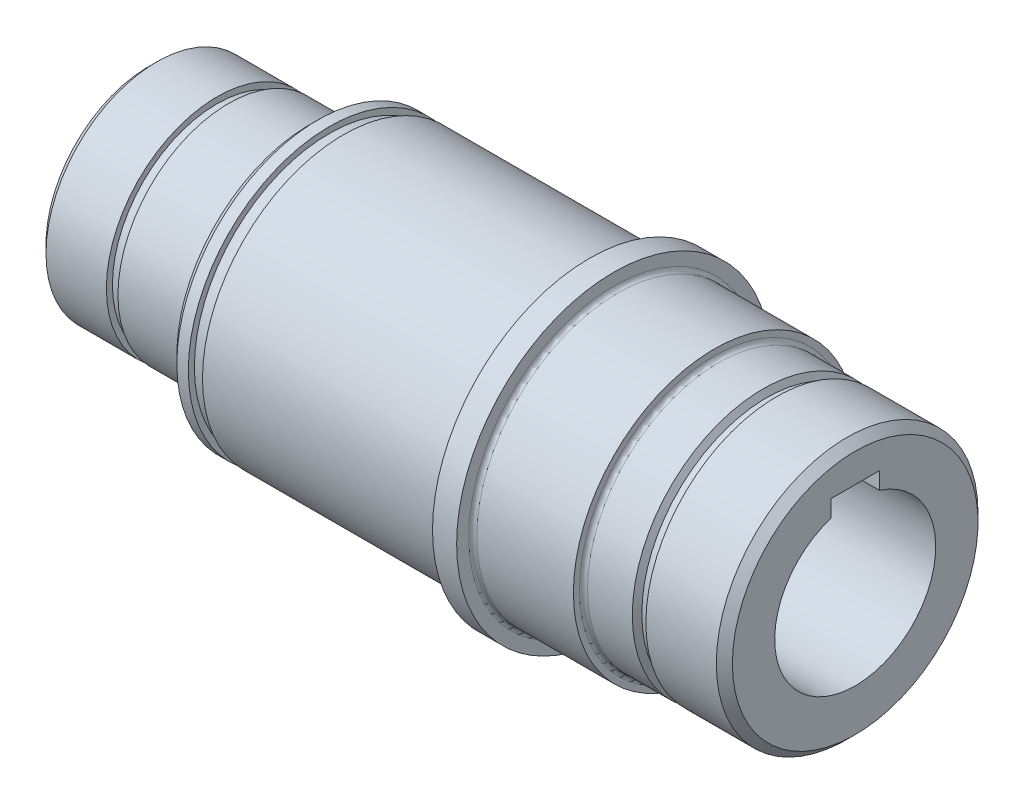
ISO-10303-21;
HEADER;
FILE_DESCRIPTION(('STEP AP214'),'2;1');
FILE_NAME('part.step','',(''),(''),'','','');
FILE_SCHEMA(('AUTOMOTIVE_DESIGN { 1 0 10303 214 1 1 1 1 }'));
ENDSEC;
DATA;
#1=APPLICATION_CONTEXT('core data for automotive mechanical design processes');
#2=APPLICATION_PROTOCOL_DEFINITION('international standard','automotive_design',2000,#1);
#3=PRODUCT_CONTEXT('',#1,'mechanical');
#4=PRODUCT('Part','Part','',(#3));
#5=PRODUCT_RELATED_PRODUCT_CATEGORY('part','',(#4));
#6=PRODUCT_DEFINITION_FORMATION('','',#4);
#7=PRODUCT_DEFINITION_CONTEXT('part definition',#1,'design');
#8=PRODUCT_DEFINITION('design','',#6,#7);
#9=PRODUCT_DEFINITION_SHAPE('','',#8);
#10=(LENGTH_UNIT() NAMED_UNIT(*) SI_UNIT(.MILLI.,.METRE.));
#11=(NAMED_UNIT(*) PLANE_ANGLE_UNIT() SI_UNIT($,.RADIAN.));
#12=(NAMED_UNIT(*) SI_UNIT($,.STERADIAN.) SOLID_ANGLE_UNIT());
#13=UNCERTAINTY_MEASURE_WITH_UNIT(LENGTH_MEASURE(1.E-05),#10,'distance_accuracy_value','');
#14=(GEOMETRIC_REPRESENTATION_CONTEXT(3) GLOBAL_UNCERTAINTY_ASSIGNED_CONTEXT((#13)) GLOBAL_UNIT_ASSIGNED_CONTEXT((#10,
#11,#12)) REPRESENTATION_CONTEXT('',''));
#15=CARTESIAN_POINT('',(0.,0.,0.));
#16=DIRECTION('',(0.,0.,1.));
#17=DIRECTION('',(1.,0.,0.));
#18=AXIS2_PLACEMENT_3D('',#15,#16,#17);
#19=CARTESIAN_POINT('',(0.,0.,0.));
#20=DIRECTION('',(-1.,0.,0.));
#21=DIRECTION('',(0.,0.,1.));
#22=AXIS2_PLACEMENT_3D('',#19,#20,#21);
#23=CYLINDRICAL_SURFACE('',#22,35.);
#24=CARTESIAN_POINT('',(108.5,0.,0.));
#25=DIRECTION('',(1.,0.,0.));
#26=DIRECTION('',(0.,0.,-1.));
#27=AXIS2_PLACEMENT_3D('',#24,#25,#26);
#28=CIRCLE('',#27,35.);
#29=CARTESIAN_POINT('',(108.5,0.,-35.));
#30=VERTEX_POINT('',#29);
#31=EDGE_CURVE('E233',#30,#30,#28,.F.);
#32=ORIENTED_EDGE('',*,*,#31,.T.);
#33=EDGE_LOOP('',(#32));
#34=FACE_BOUND('',#33,.T.);
#35=CARTESIAN_POINT('',(48.3660254037844,0.,0.));
#36=DIRECTION('',(-1.,0.,0.));
#37=DIRECTION('',(0.,0.,1.));
#38=AXIS2_PLACEMENT_3D('',#35,#36,#37);
#39=CIRCLE('',#38,35.);
#40=CARTESIAN_POINT('',(48.3660254037844,0.,35.));
#41=VERTEX_POINT('',#40);
#42=EDGE_CURVE('E120',#41,#41,#39,.T.);
#43=ORIENTED_EDGE('',*,*,#42,.F.);
#44=EDGE_LOOP('',(#43));
#45=FACE_BOUND('',#44,.T.);
#46=CARTESIAN_POINT('',(96.5,-33.5410196624969,-10.));
#47=CARTESIAN_POINT('',(96.7750872189912,-33.54098247272,-10.0000365360893));
#48=CARTESIAN_POINT('',(97.0501610866309,-33.5444026068776,-9.98865070675198));
#49=CARTESIAN_POINT('',(97.5982225360111,-33.55788623849,-9.94330432826118));
#50=CARTESIAN_POINT('',(97.8712105384974,-33.5679483583608,-9.90934846024637));
#51=CARTESIAN_POINT('',(98.4125165939655,-33.594413604027,-9.81923831824626));
#52=CARTESIAN_POINT('',(98.6808441515656,-33.6108017015027,-9.76313664788186));
#53=CARTESIAN_POINT('',(99.211600382103,-33.6494095200446,-9.62923263708805));
#54=CARTESIAN_POINT('',(99.4740289233076,-33.6716293712015,-9.55142981256278));
#55=CARTESIAN_POINT('',(99.9910594066903,-33.7212290569954,-9.37481209906698));
#56=CARTESIAN_POINT('',(100.245665225122,-33.7486062865157,-9.27600781522334));
#57=CARTESIAN_POINT('',(100.745614243321,-33.8077446180219,-9.05809844793721));
#58=CARTESIAN_POINT('',(100.990953970474,-33.8395073431819,-8.93898584406154));
#59=CARTESIAN_POINT('',(101.470763720506,-33.9065191207983,-8.6813404394909));
#60=CARTESIAN_POINT('',(101.705231950015,-33.9417687454718,-8.54280444976229));
#61=CARTESIAN_POINT('',(102.161831999763,-34.0147841313153,-8.24727956170076));
#62=CARTESIAN_POINT('',(102.383963189026,-34.0525500209621,-8.09028972082816));
#63=CARTESIAN_POINT('',(102.820103075119,-34.1305798802948,-7.75460900510778));
#64=CARTESIAN_POINT('',(103.033754390697,-34.17088316088,-7.57546276900981));
#65=CARTESIAN_POINT('',(103.445314601006,-34.2519587918208,-7.20001350476827));
#66=CARTESIAN_POINT('',(103.643223272493,-34.2927311488189,-7.0037102334069));
#67=CARTESIAN_POINT('',(104.022063940254,-34.3736408909465,-6.59516291750775));
#68=CARTESIAN_POINT('',(104.202992879867,-34.4137781606715,-6.38291601516099));
#69=CARTESIAN_POINT('',(104.546629614172,-34.4923217776482,-5.94385936590824));
#70=CARTESIAN_POINT('',(104.709337925007,-34.5307281739127,-5.71705003180525));
#71=CARTESIAN_POINT('',(105.018300842206,-34.6054699464445,-5.24589340555309));
#72=CARTESIAN_POINT('',(105.164187116516,-34.6417525803369,-5.00129596788593));
#73=CARTESIAN_POINT('',(105.434712979143,-34.7104015648878,-4.50021525068414));
#74=CARTESIAN_POINT('',(105.559360803192,-34.7427694321742,-4.24373662766712));
#75=CARTESIAN_POINT('',(105.78647166388,-34.8026802322956,-3.72058575986785));
#76=CARTESIAN_POINT('',(105.888934538248,-34.8302231298386,-3.45391344054172));
#77=CARTESIAN_POINT('',(106.070791583086,-34.8796844486166,-2.91230878338613));
#78=CARTESIAN_POINT('',(106.150186465233,-34.9016030433665,-2.63737670067014));
#79=CARTESIAN_POINT('',(106.283430843011,-34.9386824573288,-2.08857017737901));
#80=CARTESIAN_POINT('',(106.337892722128,-34.9540046534084,-1.81485525332598));
#81=CARTESIAN_POINT('',(106.423772221713,-34.9782725964626,-1.2635532068249));
#82=CARTESIAN_POINT('',(106.455190204717,-34.9872184437524,-0.985966145364852));
#83=CARTESIAN_POINT('',(106.494690755232,-34.9984783115281,-0.429042577413923));
#84=CARTESIAN_POINT('',(106.502776691916,-35.0007932895185,-0.149706329346247));
#85=CARTESIAN_POINT('',(106.495547124931,-34.99872781944,0.40863588853731));
#86=CARTESIAN_POINT('',(106.48023200763,-34.9943474819159,0.687641863730135));
#87=CARTESIAN_POINT('',(106.427125950851,-34.979239676817,1.23515924205468));
#88=CARTESIAN_POINT('',(106.389998894474,-34.9686997350484,1.503740537151));
#89=CARTESIAN_POINT('',(106.294137218641,-34.9417087498089,2.03670936087621));
#90=CARTESIAN_POINT('',(106.235403089012,-34.9252578403382,2.30109698443278));
#91=CARTESIAN_POINT('',(106.096828297775,-34.8868841581542,2.82382541600096));
#92=CARTESIAN_POINT('',(106.016990941752,-34.8649622424428,3.08216716413866));
#93=CARTESIAN_POINT('',(105.836810274628,-34.8162103963017,3.59122625345116));
#94=CARTESIAN_POINT('',(105.736459138934,-34.7893785934989,3.84194064326846));
#95=CARTESIAN_POINT('',(105.514872653335,-34.7312018919979,4.33662254761107));
#96=CARTESIAN_POINT('',(105.393428790896,-34.6998125025795,4.58049139181082));
#97=CARTESIAN_POINT('',(105.131233286698,-34.6335400843056,5.05725829801619));
#98=CARTESIAN_POINT('',(104.990473062352,-34.5986555043474,5.29015142117991));
#99=CARTESIAN_POINT('',(104.690637059534,-34.5262997215508,5.74345927995585));
#100=CARTESIAN_POINT('',(104.531558327985,-34.4888281020536,5.96387199506769));
#101=CARTESIAN_POINT('',(104.196219908203,-34.4122822535693,6.39076242941755));
#102=CARTESIAN_POINT('',(104.019967281927,-34.373208687104,6.59724581781994));
#103=CARTESIAN_POINT('',(103.644792481781,-34.2930504133064,7.00219950736256));
#104=CARTESIAN_POINT('',(103.445288342202,-34.2519435020112,7.20012664060528));
#105=CARTESIAN_POINT('',(103.030351607355,-34.1702230234806,7.57847708088305));
#106=CARTESIAN_POINT('',(102.81492423327,-34.1296092995715,7.75890608103356));
#107=CARTESIAN_POINT('',(102.369353305942,-34.0499816296953,8.10121311351374));
#108=CARTESIAN_POINT('',(102.139202750601,-34.0109684596198,8.26308221533716));
#109=CARTESIAN_POINT('',(101.665765191648,-33.935682173311,8.56702972033076));
#110=CARTESIAN_POINT('',(101.422478586095,-33.8994089741285,8.70910872273119));
#111=CARTESIAN_POINT('',(100.922213172047,-33.8303722143045,8.9735591116493));
#112=CARTESIAN_POINT('',(100.665134658013,-33.7976414958782,9.09575063013379));
#113=CARTESIAN_POINT('',(100.141012358617,-33.7370601860415,9.31794179575966));
#114=CARTESIAN_POINT('',(99.8739690730358,-33.7092093502798,9.41794255412977));
#115=CARTESIAN_POINT('',(99.3321579702681,-33.6592997079518,9.59478968632395));
#116=CARTESIAN_POINT('',(99.0574000396033,-33.6372338320702,9.6716643377374));
#117=CARTESIAN_POINT('',(98.5020089105734,-33.5995731264667,9.80169669852144));
#118=CARTESIAN_POINT('',(98.2213784974586,-33.5839752989599,9.85486539589321));
#119=CARTESIAN_POINT('',(97.7006697711561,-33.5616603042316,9.93057481078496));
#120=CARTESIAN_POINT('',(97.4611367403342,-33.553933788227,9.95661201264007));
#121=CARTESIAN_POINT('',(96.9810754105778,-33.5436069779552,9.99132081128702));
#122=CARTESIAN_POINT('',(96.7405491928636,-33.5409988653378,10.0000188938676));
#123=CARTESIAN_POINT('',(96.5,-33.5410196624969,10.));
#124=B_SPLINE_CURVE_WITH_KNOTS('',3,(#46,#47,#48,#49,#50,#51,#52,#53,#54,#55,#56,#57,#58,#59,
#60,#61,#62,#63,#64,#65,#66,#67,#68,#69,#70,#71,#72,#73,#74,#75,#76,#77,#78,#79,#80,#81,#82,#83,
#84,#85,#86,#87,#88,#89,#90,#91,#92,#93,#94,#95,#96,#97,#98,#99,#100,#101,#102,#103,#104,#105,
#106,#107,#108,#109,#110,#111,#112,#113,#114,#115,#116,#117,#118,#119,#120,#121,#122,#123),
.UNSPECIFIED.,.F.,.F.,(4,2,2,2,2,2,2,2,2,2,2,2,2,2,2,2,2,2,2,2,2,2,2,2,2,2,2,2,2,2,2,2,2,2,2,2,
2,2,4),(0.,0.824984357624068,1.64979766274566,2.4726634396547,3.29554757401041,4.11801715879569,
4.94079197884894,5.76370204493681,6.58665415984562,7.43083682322429,8.27503145566178,
9.1193777681235,9.96370015635821,10.8239516934824,11.6838688839443,12.5437923639629,
13.4036893113833,14.2411536565694,15.0786048261527,15.9159350607945,16.7532514706184,
17.5663142232641,18.379358545133,19.1922755880901,20.0055032833981,20.8272825171044,
21.6494280707064,22.4717063462234,23.2936479140539,24.1447133665263,24.995500984547,
25.8466962750067,26.6978657862673,27.5563505279373,28.4147922702562,29.2721800407936,
30.1291699873618,30.8517080106868,31.5731414970245),.UNSPECIFIED.);
#125=CARTESIAN_POINT('',(96.5,-33.5410196624969,-10.));
#126=VERTEX_POINT('',#125);
#127=CARTESIAN_POINT('',(96.5,-33.5410196624969,10.));
#128=VERTEX_POINT('',#127);
#129=EDGE_CURVE('E239',#126,#128,#124,.T.);
#130=ORIENTED_EDGE('',*,*,#129,.F.);
#131=DIRECTION('',(-1.,0.,0.));
#132=VECTOR('',#131,1.);
#133=CARTESIAN_POINT('',(0.,-33.5410196624969,-10.));
#134=LINE('',#133,#132);
#135=CARTESIAN_POINT('',(60.5,-33.5410196624969,-10.));
#136=VERTEX_POINT('',#135);
#137=EDGE_CURVE('E11',#136,#126,#134,.F.);
#138=ORIENTED_EDGE('',*,*,#137,.F.);
#139=CARTESIAN_POINT('',(60.5,-33.5410196624969,10.));
#140=CARTESIAN_POINT('',(60.2249127810088,-33.54098247272,10.0000365360893));
#141=CARTESIAN_POINT('',(59.9498389133691,-33.5444026068776,9.98865070675198));
#142=CARTESIAN_POINT('',(59.4017774639889,-33.55788623849,9.94330432826118));
#143=CARTESIAN_POINT('',(59.1287894615026,-33.5679483583608,9.90934846024636));
#144=CARTESIAN_POINT('',(58.5874834060345,-33.594413604027,9.81923831824626));
#145=CARTESIAN_POINT('',(58.3191558484344,-33.6108017015027,9.76313664788186));
#146=CARTESIAN_POINT('',(57.788399617897,-33.6494095200446,9.62923263708805));
#147=CARTESIAN_POINT('',(57.5259710766924,-33.6716293712015,9.55142981256278));
#148=CARTESIAN_POINT('',(57.0089405933097,-33.7212290569954,9.37481209906698));
#149=CARTESIAN_POINT('',(56.754334774878,-33.7486062865157,9.27600781522333));
#150=CARTESIAN_POINT('',(56.254385756679,-33.8077446180219,9.0580984479372));
#151=CARTESIAN_POINT('',(56.0090460295259,-33.8395073431819,8.93898584406154));
#152=CARTESIAN_POINT('',(55.5292362794943,-33.9065191207983,8.68134043949089));
#153=CARTESIAN_POINT('',(55.2947680499847,-33.9417687454718,8.54280444976228));
#154=CARTESIAN_POINT('',(54.8381680002374,-34.0147841313154,8.24727956170075));
#155=CARTESIAN_POINT('',(54.6160368109742,-34.0525500209621,8.09028972082816));
#156=CARTESIAN_POINT('',(54.1798969248815,-34.1305798802948,7.75460900510779));
#157=CARTESIAN_POINT('',(53.9662456093028,-34.17088316088,7.57546276900981));
#158=CARTESIAN_POINT('',(53.5546853989937,-34.2519587918208,7.20001350476826));
#159=CARTESIAN_POINT('',(53.3567767275066,-34.2927311488189,7.0037102334069));
#160=CARTESIAN_POINT('',(52.9779360597461,-34.3736408909465,6.59516291750775));
#161=CARTESIAN_POINT('',(52.7970071201329,-34.4137781606715,6.38291601516098));
#162=CARTESIAN_POINT('',(52.4533703858284,-34.4923217776482,5.94385936590823));
#163=CARTESIAN_POINT('',(52.2906620749933,-34.5307281739127,5.71705003180523));
#164=CARTESIAN_POINT('',(51.9816991577943,-34.6054699464445,5.24589340555307));
#165=CARTESIAN_POINT('',(51.8358128834841,-34.6417525803369,5.00129596788592));
#166=CARTESIAN_POINT('',(51.5652870208566,-34.7104015648878,4.50021525068413));
#167=CARTESIAN_POINT('',(51.4406391968075,-34.7427694321742,4.24373662766711));
#168=CARTESIAN_POINT('',(51.2135283361205,-34.8026802322956,3.72058575986784));
#169=CARTESIAN_POINT('',(51.1110654617519,-34.8302231298386,3.45391344054171));
#170=CARTESIAN_POINT('',(50.9292084169142,-34.8796844486166,2.91230878338613));
#171=CARTESIAN_POINT('',(50.849813534767,-34.9016030433665,2.63737670067014));
#172=CARTESIAN_POINT('',(50.7165691569895,-34.9386824573288,2.088570177379));
#173=CARTESIAN_POINT('',(50.6621072778723,-34.9540046534084,1.81485525332598));
#174=CARTESIAN_POINT('',(50.5762277782868,-34.9782725964626,1.26355320682489));
#175=CARTESIAN_POINT('',(50.5448097952828,-34.9872184437524,0.98596614536485));
#176=CARTESIAN_POINT('',(50.505309244768,-34.9984783115281,0.429042577413922));
#177=CARTESIAN_POINT('',(50.4972233080835,-35.0007932895185,0.149706329346246));
#178=CARTESIAN_POINT('',(50.504452875069,-34.99872781944,-0.408635888537313));
#179=CARTESIAN_POINT('',(50.5197679923695,-34.9943474819159,-0.687641863730138));
#180=CARTESIAN_POINT('',(50.5728740491488,-34.979239676817,-1.23515924205469));
#181=CARTESIAN_POINT('',(50.610001105526,-34.9686997350484,-1.50374053715101));
#182=CARTESIAN_POINT('',(50.705862781359,-34.9417087498089,-2.03670936087622));
#183=CARTESIAN_POINT('',(50.7645969109882,-34.9252578403382,-2.30109698443279));
#184=CARTESIAN_POINT('',(50.9031717022248,-34.8868841581542,-2.82382541600097));
#185=CARTESIAN_POINT('',(50.9830090582476,-34.8649622424428,-3.08216716413866));
#186=CARTESIAN_POINT('',(51.1631897253718,-34.8162103963017,-3.59122625345116));
#187=CARTESIAN_POINT('',(51.2635408610665,-34.7893785934989,-3.84194064326847));
#188=CARTESIAN_POINT('',(51.4851273466646,-34.7312018919979,-4.33662254761108));
#189=CARTESIAN_POINT('',(51.6065712091042,-34.6998125025795,-4.58049139181083));
#190=CARTESIAN_POINT('',(51.8687667133016,-34.6335400843056,-5.0572582980162));
#191=CARTESIAN_POINT('',(52.0095269376479,-34.5986555043474,-5.29015142117992));
#192=CARTESIAN_POINT('',(52.309362940466,-34.5262997215508,-5.74345927995586));
#193=CARTESIAN_POINT('',(52.4684416720154,-34.4888281020536,-5.96387199506769));
#194=CARTESIAN_POINT('',(52.8037800917972,-34.4122822535693,-6.39076242941755));
#195=CARTESIAN_POINT('',(52.9800327180733,-34.373208687104,-6.59724581781994));
#196=CARTESIAN_POINT('',(53.3552075182186,-34.2930504133064,-7.00219950736256));
#197=CARTESIAN_POINT('',(53.5547116577979,-34.2519435020112,-7.20012664060527));
#198=CARTESIAN_POINT('',(53.9696483926452,-34.1702230234806,-7.57847708088304));
#199=CARTESIAN_POINT('',(54.1850757667298,-34.1296092995715,-7.75890608103355));
#200=CARTESIAN_POINT('',(54.6306466940576,-34.0499816296953,-8.10121311351374));
#201=CARTESIAN_POINT('',(54.8607972493985,-34.0109684596198,-8.26308221533716));
#202=CARTESIAN_POINT('',(55.3342348083521,-33.9356821733109,-8.56702972033075));
#203=CARTESIAN_POINT('',(55.5775214139048,-33.8994089741285,-8.70910872273119));
#204=CARTESIAN_POINT('',(56.0777868279535,-33.8303722143045,-8.97355911164931));
#205=CARTESIAN_POINT('',(56.334865341987,-33.7976414958782,-9.09575063013379));
#206=CARTESIAN_POINT('',(56.8589876413826,-33.7370601860415,-9.31794179575967));
#207=CARTESIAN_POINT('',(57.1260309269642,-33.7092093502798,-9.41794255412978));
#208=CARTESIAN_POINT('',(57.6678420297319,-33.6592997079518,-9.59478968632395));
#209=CARTESIAN_POINT('',(57.9425999603967,-33.6372338320702,-9.67166433773741));
#210=CARTESIAN_POINT('',(58.4979910894266,-33.5995731264667,-9.80169669852144));
#211=CARTESIAN_POINT('',(58.7786215025414,-33.5839752989599,-9.85486539589321));
#212=CARTESIAN_POINT('',(59.2993302288439,-33.5616603042316,-9.93057481078497));
#213=CARTESIAN_POINT('',(59.5388632596659,-33.553933788227,-9.95661201264007));
#214=CARTESIAN_POINT('',(60.0189245894223,-33.5436069779552,-9.99132081128703));
#215=CARTESIAN_POINT('',(60.2594508071364,-33.5409988653378,-10.0000188938676));
#216=CARTESIAN_POINT('',(60.5,-33.5410196624969,-10.));
#217=B_SPLINE_CURVE_WITH_KNOTS('',3,(#139,#140,#141,#142,#143,#144,#145,#146,#147,#148,#149,
#150,#151,#152,#153,#154,#155,#156,#157,#158,#159,#160,#161,#162,#163,#164,#165,#166,#167,#168,
#169,#170,#171,#172,#173,#174,#175,#176,#177,#178,#179,#180,#181,#182,#183,#184,#185,#186,#187,
#188,#189,#190,#191,#192,#193,#194,#195,#196,#197,#198,#199,#200,#201,#202,#203,#204,#205,#206,
#207,#208,#209,#210,#211,#212,#213,#214,#215,#216),.UNSPECIFIED.,.F.,.F.,(4,2,2,2,2,2,2,2,2,2,2,
2,2,2,2,2,2,2,2,2,2,2,2,2,2,2,2,2,2,2,2,2,2,2,2,2,2,2,4),(0.,0.824984357624061,1.64979766274566,
2.4726634396547,3.29554757401041,4.11801715879571,4.94079197884896,5.76370204493684,
6.58665415984562,7.4308368232243,8.27503145566178,9.11937776812352,9.96370015635822,
10.8239516934824,11.6838688839443,12.5437923639629,13.4036893113833,14.2411536565694,
15.0786048261527,15.9159350607945,16.7532514706184,17.5663142232641,18.379358545133,
19.1922755880901,20.0055032833981,20.8272825171044,21.6494280707064,22.4717063462234,
23.2936479140539,24.1447133665263,24.995500984547,25.8466962750067,26.6978657862673,
27.5563505279373,28.4147922702562,29.2721800407936,30.1291699873618,30.8517080106868,
31.5731414970245),.UNSPECIFIED.);
#218=CARTESIAN_POINT('',(60.5,-33.5410196624969,10.));
#219=VERTEX_POINT('',#218);
#220=EDGE_CURVE('E43',#219,#136,#217,.T.);
#221=ORIENTED_EDGE('',*,*,#220,.F.);
#222=DIRECTION('',(-1.,0.,0.));
#223=VECTOR('',#222,1.);
#224=CARTESIAN_POINT('',(0.,-33.5410196624969,10.));
#225=LINE('',#224,#223);
#226=EDGE_CURVE('E119',#128,#219,#225,.T.);
#227=ORIENTED_EDGE('',*,*,#226,.F.);
#228=EDGE_LOOP('',(#130,#138,#221,#227));
#229=FACE_BOUND('',#228,.T.);
#230=ADVANCED_FACE('F35',(#34,#45,#229),#23,.T.);
#231=CARTESIAN_POINT('',(42.0000000000001,0.,0.));
#232=DIRECTION('',(1.,0.,0.));
#233=DIRECTION('',(0.,0.,-1.));
#234=AXIS2_PLACEMENT_3D('',#231,#232,#233);
#235=CIRCLE('',#234,35.);
#236=CARTESIAN_POINT('',(42.0000000000001,0.,-35.));
#237=VERTEX_POINT('',#236);
#238=EDGE_CURVE('E206',#237,#237,#235,.T.);
#239=ORIENTED_EDGE('',*,*,#238,.T.);
#240=EDGE_LOOP('',(#239));
#241=FACE_BOUND('',#240,.T.);
#242=CARTESIAN_POINT('',(44.85,0.,0.));
#243=DIRECTION('',(-1.,0.,0.));
#244=DIRECTION('',(0.,0.,1.));
#245=AXIS2_PLACEMENT_3D('',#242,#243,#244);
#246=CIRCLE('',#245,35.);
#247=CARTESIAN_POINT('',(44.85,0.,35.));
#248=VERTEX_POINT('',#247);
#249=EDGE_CURVE('E135',#248,#248,#246,.T.);
#250=ORIENTED_EDGE('',*,*,#249,.T.);
#251=EDGE_LOOP('',(#250));
#252=FACE_BOUND('',#251,.T.);
#253=ADVANCED_FACE('F247',(#241,#252),#23,.T.);
#254=CARTESIAN_POINT('',(0.,0.,0.));
#255=DIRECTION('',(1.,0.,0.));
#256=DIRECTION('',(0.,0.,-1.));
#257=AXIS2_PLACEMENT_3D('',#254,#255,#256);
#258=PLANE('',#257);
#259=CARTESIAN_POINT('',(0.,0.,0.));
#260=DIRECTION('',(1.,0.,0.));
#261=DIRECTION('',(0.,0.,-1.));
#262=AXIS2_PLACEMENT_3D('',#259,#260,#261);
#263=CIRCLE('',#262,25.5);
#264=CARTESIAN_POINT('',(0.,0.,-25.5));
#265=VERTEX_POINT('',#264);
#266=EDGE_CURVE('E215',#265,#265,#263,.F.);
#267=ORIENTED_EDGE('',*,*,#266,.T.);
#268=EDGE_LOOP('',(#267));
#269=FACE_BOUND('',#268,.T.);
#270=CARTESIAN_POINT('',(0.,0.,0.));
#271=DIRECTION('',(-1.,0.,0.));
#272=DIRECTION('',(0.,-1.,0.));
#273=AXIS2_PLACEMENT_3D('',#270,#271,#272);
#274=CIRCLE('',#273,20.);
#275=CARTESIAN_POINT('',(0.,19.0787840283389,-6.));
#276=VERTEX_POINT('',#275);
#277=CARTESIAN_POINT('',(0.,19.0787840283389,6.));
#278=VERTEX_POINT('',#277);
#279=EDGE_CURVE('E152',#276,#278,#274,.T.);
#280=ORIENTED_EDGE('',*,*,#279,.F.);
#281=DIRECTION('',(0.,-1.,0.));
#282=VECTOR('',#281,1.);
#283=CARTESIAN_POINT('',(0.,0.,-6.00000000000001));
#284=LINE('',#283,#282);
#285=CARTESIAN_POINT('',(0.,23.3,-6.));
#286=VERTEX_POINT('',#285);
#287=EDGE_CURVE('E57',#286,#276,#284,.T.);
#288=ORIENTED_EDGE('',*,*,#287,.F.);
#289=DIRECTION('',(0.,0.,1.));
#290=VECTOR('',#289,1.);
#291=CARTESIAN_POINT('',(0.,23.3,0.));
#292=LINE('',#291,#290);
#293=CARTESIAN_POINT('',(0.,23.3,6.));
#294=VERTEX_POINT('',#293);
#295=EDGE_CURVE('E142',#286,#294,#292,.T.);
#296=ORIENTED_EDGE('',*,*,#295,.T.);
#297=DIRECTION('',(0.,-1.,0.));
#298=VECTOR('',#297,1.);
#299=CARTESIAN_POINT('',(0.,0.,6.00000000000002));
#300=LINE('',#299,#298);
#301=EDGE_CURVE('E155',#294,#278,#300,.T.);
#302=ORIENTED_EDGE('',*,*,#301,.T.);
#303=EDGE_LOOP('',(#280,#288,#296,#302));
#304=FACE_BOUND('',#303,.T.);
#305=ADVANCED_FACE('F287',(#269,#304),#258,.F.);
#306=CARTESIAN_POINT('',(0.,0.,0.));
#307=DIRECTION('',(-1.,0.,0.));
#308=DIRECTION('',(0.,0.,1.));
#309=AXIS2_PLACEMENT_3D('',#306,#307,#308);
#310=CYLINDRICAL_SURFACE('',#309,27.5);
#311=CARTESIAN_POINT('',(1.99999999999999,0.,0.));
#312=DIRECTION('',(1.,0.,0.));
#313=DIRECTION('',(0.,0.,-1.));
#314=AXIS2_PLACEMENT_3D('',#311,#312,#313);
#315=CIRCLE('',#314,27.5);
#316=CARTESIAN_POINT('',(1.99999999999999,0.,-27.5));
#317=VERTEX_POINT('',#316);
#318=EDGE_CURVE('E218',#317,#317,#315,.T.);
#319=ORIENTED_EDGE('',*,*,#318,.T.);
#320=EDGE_LOOP('',(#319));
#321=FACE_BOUND('',#320,.T.);
#322=CARTESIAN_POINT('',(17.,0.,0.));
#323=DIRECTION('',(-1.,0.,0.));
#324=DIRECTION('',(0.,0.,1.));
#325=AXIS2_PLACEMENT_3D('',#322,#323,#324);
#326=CIRCLE('',#325,27.5);
#327=CARTESIAN_POINT('',(17.,0.,27.5));
#328=VERTEX_POINT('',#327);
#329=EDGE_CURVE('E200',#328,#328,#326,.T.);
#330=ORIENTED_EDGE('',*,*,#329,.T.);
#331=EDGE_LOOP('',(#330));
#332=FACE_BOUND('',#331,.T.);
#333=ADVANCED_FACE('F403',(#321,#332),#310,.T.);
#334=CARTESIAN_POINT('',(17.,26.,0.));
#335=DIRECTION('',(-1.,0.,0.));
#336=DIRECTION('',(0.,0.,1.));
#337=AXIS2_PLACEMENT_3D('',#334,#335,#336);
#338=PLANE('',#337);
#339=ORIENTED_EDGE('',*,*,#329,.F.);
#340=EDGE_LOOP('',(#339));
#341=FACE_BOUND('',#340,.T.);
#342=CARTESIAN_POINT('',(17.,0.,0.));
#343=DIRECTION('',(-1.,0.,0.));
#344=DIRECTION('',(0.,0.,1.));
#345=AXIS2_PLACEMENT_3D('',#342,#343,#344);
#346=CIRCLE('',#345,26.);
#347=CARTESIAN_POINT('',(17.,0.,26.));
#348=VERTEX_POINT('',#347);
#349=EDGE_CURVE('E197',#348,#348,#346,.T.);
#350=ORIENTED_EDGE('',*,*,#349,.T.);
#351=EDGE_LOOP('',(#350));
#352=FACE_BOUND('',#351,.T.);
#353=ADVANCED_FACE('F399',(#341,#352),#338,.F.);
#354=CARTESIAN_POINT('',(0.,0.,0.));
#355=DIRECTION('',(-1.,0.,0.));
#356=DIRECTION('',(0.,0.,1.));
#357=AXIS2_PLACEMENT_3D('',#354,#355,#356);
#358=CYLINDRICAL_SURFACE('',#357,26.);
#359=ORIENTED_EDGE('',*,*,#349,.F.);
#360=EDGE_LOOP('',(#359));
#361=FACE_BOUND('',#360,.T.);
#362=CARTESIAN_POINT('',(19.,0.,0.));
#363=DIRECTION('',(-1.,0.,0.));
#364=DIRECTION('',(0.,0.,1.));
#365=AXIS2_PLACEMENT_3D('',#362,#363,#364);
#366=CIRCLE('',#365,26.);
#367=CARTESIAN_POINT('',(19.,0.,26.));
#368=VERTEX_POINT('',#367);
#369=EDGE_CURVE('E194',#368,#368,#366,.T.);
#370=ORIENTED_EDGE('',*,*,#369,.T.);
#371=EDGE_LOOP('',(#370));
#372=FACE_BOUND('',#371,.T.);
#373=ADVANCED_FACE('F395',(#361,#372),#358,.T.);
#374=CARTESIAN_POINT('',(19.8660254037844,0.,0.));
#375=DIRECTION('',(1.,0.,0.));
#376=DIRECTION('',(0.,0.,-1.));
#377=AXIS2_PLACEMENT_3D('',#374,#375,#376);
#378=CONICAL_SURFACE('',#377,27.5,1.0471975511966);
#379=ORIENTED_EDGE('',*,*,#369,.F.);
#380=EDGE_LOOP('',(#379));
#381=FACE_BOUND('',#380,.T.);
#382=CARTESIAN_POINT('',(19.8660254037844,0.,0.));
#383=DIRECTION('',(-1.,0.,0.));
#384=DIRECTION('',(0.,0.,1.));
#385=AXIS2_PLACEMENT_3D('',#382,#383,#384);
#386=CIRCLE('',#385,27.5);
#387=CARTESIAN_POINT('',(19.8660254037844,0.,27.5));
#388=VERTEX_POINT('',#387);
#389=EDGE_CURVE('E191',#388,#388,#386,.T.);
#390=ORIENTED_EDGE('',*,*,#389,.T.);
#391=EDGE_LOOP('',(#390));
#392=FACE_BOUND('',#391,.T.);
#393=ADVANCED_FACE('F388',(#381,#392),#378,.T.);
#394=CARTESIAN_POINT('',(0.,0.,0.));
#395=DIRECTION('',(-1.,0.,0.));
#396=DIRECTION('',(0.,0.,1.));
#397=AXIS2_PLACEMENT_3D('',#394,#395,#396);
#398=CYLINDRICAL_SURFACE('',#397,27.5);
#399=ORIENTED_EDGE('',*,*,#389,.F.);
#400=EDGE_LOOP('',(#399));
#401=FACE_BOUND('',#400,.T.);
#402=CARTESIAN_POINT('',(40.,0.,0.));
#403=DIRECTION('',(-1.,0.,0.));
#404=DIRECTION('',(0.,0.,1.));
#405=AXIS2_PLACEMENT_3D('',#402,#403,#404);
#406=CIRCLE('',#405,27.5);
#407=CARTESIAN_POINT('',(40.,0.,27.5));
#408=VERTEX_POINT('',#407);
#409=EDGE_CURVE('E188',#408,#408,#406,.T.);
#410=ORIENTED_EDGE('',*,*,#409,.T.);
#411=EDGE_LOOP('',(#410));
#412=FACE_BOUND('',#411,.T.);
#413=ADVANCED_FACE('F376',(#401,#412),#398,.T.);
#414=CARTESIAN_POINT('',(40.,27.5,0.));
#415=DIRECTION('',(1.,0.,0.));
#416=DIRECTION('',(0.,0.,-1.));
#417=AXIS2_PLACEMENT_3D('',#414,#415,#416);
#418=PLANE('',#417);
#419=CARTESIAN_POINT('',(40.,0.,0.));
#420=DIRECTION('',(1.,0.,0.));
#421=DIRECTION('',(0.,0.,-1.));
#422=AXIS2_PLACEMENT_3D('',#419,#420,#421);
#423=CIRCLE('',#422,32.9999999999999);
#424=CARTESIAN_POINT('',(40.,0.,-32.9999999999999));
#425=VERTEX_POINT('',#424);
#426=EDGE_CURVE('E203',#425,#425,#423,.F.);
#427=ORIENTED_EDGE('',*,*,#426,.T.);
#428=EDGE_LOOP('',(#427));
#429=FACE_BOUND('',#428,.T.);
#430=ORIENTED_EDGE('',*,*,#409,.F.);
#431=EDGE_LOOP('',(#430));
#432=FACE_BOUND('',#431,.T.);
#433=ADVANCED_FACE('F371',(#429,#432),#418,.F.);
#434=CARTESIAN_POINT('',(109.5,35.,0.));
#435=DIRECTION('',(1.,0.,0.));
#436=DIRECTION('',(0.,0.,-1.));
#437=AXIS2_PLACEMENT_3D('',#434,#435,#436);
#438=PLANE('',#437);
#439=CARTESIAN_POINT('',(109.5,0.,0.));
#440=DIRECTION('',(1.,0.,0.));
#441=DIRECTION('',(0.,0.,-1.));
#442=AXIS2_PLACEMENT_3D('',#439,#440,#441);
#443=CIRCLE('',#442,36.);
#444=CARTESIAN_POINT('',(109.5,0.,-36.));
#445=VERTEX_POINT('',#444);
#446=EDGE_CURVE('E236',#445,#445,#443,.T.);
#447=ORIENTED_EDGE('',*,*,#446,.T.);
#448=EDGE_LOOP('',(#447));
#449=FACE_BOUND('',#448,.T.);
#450=CARTESIAN_POINT('',(109.5,0.,0.));
#451=DIRECTION('',(-1.,0.,0.));
#452=DIRECTION('',(0.,0.,1.));
#453=AXIS2_PLACEMENT_3D('',#450,#451,#452);
#454=CIRCLE('',#453,39.);
#455=CARTESIAN_POINT('',(109.5,0.,39.));
#456=VERTEX_POINT('',#455);
#457=EDGE_CURVE('E185',#456,#456,#454,.T.);
#458=ORIENTED_EDGE('',*,*,#457,.T.);
#459=EDGE_LOOP('',(#458));
#460=FACE_BOUND('',#459,.T.);
#461=ADVANCED_FACE('F368',(#449,#460),#438,.F.);
#462=CARTESIAN_POINT('',(0.,0.,0.));
#463=DIRECTION('',(-1.,0.,0.));
#464=DIRECTION('',(0.,0.,1.));
#465=AXIS2_PLACEMENT_3D('',#462,#463,#464);
#466=CYLINDRICAL_SURFACE('',#465,39.);
#467=ORIENTED_EDGE('',*,*,#457,.F.);
#468=EDGE_LOOP('',(#467));
#469=FACE_BOUND('',#468,.T.);
#470=CARTESIAN_POINT('',(115.5,0.,0.));
#471=DIRECTION('',(-1.,0.,0.));
#472=DIRECTION('',(0.,0.,1.));
#473=AXIS2_PLACEMENT_3D('',#470,#471,#472);
#474=CIRCLE('',#473,39.);
#475=CARTESIAN_POINT('',(115.5,0.,39.));
#476=VERTEX_POINT('',#475);
#477=EDGE_CURVE('E182',#476,#476,#474,.T.);
#478=ORIENTED_EDGE('',*,*,#477,.T.);
#479=EDGE_LOOP('',(#478));
#480=FACE_BOUND('',#479,.T.);
#481=ADVANCED_FACE('F365',(#469,#480),#466,.T.);
#482=CARTESIAN_POINT('',(115.5,39.,0.));
#483=DIRECTION('',(-1.,0.,0.));
#484=DIRECTION('',(0.,0.,1.));
#485=AXIS2_PLACEMENT_3D('',#482,#483,#484);
#486=PLANE('',#485);
#487=CARTESIAN_POINT('',(115.5,0.,0.));
#488=DIRECTION('',(-1.,0.,0.));
#489=DIRECTION('',(0.,0.,1.));
#490=AXIS2_PLACEMENT_3D('',#487,#488,#489);
#491=CIRCLE('',#490,36.);
#492=CARTESIAN_POINT('',(115.5,0.,36.));
#493=VERTEX_POINT('',#492);
#494=EDGE_CURVE('E221',#493,#493,#491,.T.);
#495=ORIENTED_EDGE('',*,*,#494,.T.);
#496=EDGE_LOOP('',(#495));
#497=FACE_BOUND('',#496,.T.);
#498=ORIENTED_EDGE('',*,*,#477,.F.);
#499=EDGE_LOOP('',(#498));
#500=FACE_BOUND('',#499,.T.);
#501=ADVANCED_FACE('F361',(#497,#500),#486,.F.);
#502=CARTESIAN_POINT('',(0.,0.,0.));
#503=DIRECTION('',(-1.,0.,0.));
#504=DIRECTION('',(0.,0.,1.));
#505=AXIS2_PLACEMENT_3D('',#502,#503,#504);
#506=CYLINDRICAL_SURFACE('',#505,35.);
#507=CARTESIAN_POINT('',(116.5,0.,0.));
#508=DIRECTION('',(-1.,0.,0.));
#509=DIRECTION('',(0.,0.,1.));
#510=AXIS2_PLACEMENT_3D('',#507,#508,#509);
#511=CIRCLE('',#510,35.);
#512=CARTESIAN_POINT('',(116.5,0.,35.));
#513=VERTEX_POINT('',#512);
#514=EDGE_CURVE('E224',#513,#513,#511,.F.);
#515=ORIENTED_EDGE('',*,*,#514,.T.);
#516=EDGE_LOOP('',(#515));
#517=FACE_BOUND('',#516,.T.);
#518=CARTESIAN_POINT('',(140.5,0.,0.));
#519=DIRECTION('',(-1.,0.,0.));
#520=DIRECTION('',(0.,0.,1.));
#521=AXIS2_PLACEMENT_3D('',#518,#519,#520);
#522=CIRCLE('',#521,35.);
#523=CARTESIAN_POINT('',(140.5,0.,35.));
#524=VERTEX_POINT('',#523);
#525=EDGE_CURVE('E179',#524,#524,#522,.T.);
#526=ORIENTED_EDGE('',*,*,#525,.T.);
#527=EDGE_LOOP('',(#526));
#528=FACE_BOUND('',#527,.T.);
#529=ADVANCED_FACE('F357',(#517,#528),#506,.T.);
#530=CARTESIAN_POINT('',(140.5,35.,0.));
#531=DIRECTION('',(-1.,0.,0.));
#532=DIRECTION('',(0.,0.,1.));
#533=AXIS2_PLACEMENT_3D('',#530,#531,#532);
#534=PLANE('',#533);
#535=CARTESIAN_POINT('',(140.5,0.,0.));
#536=DIRECTION('',(-1.,0.,0.));
#537=DIRECTION('',(0.,0.,1.));
#538=AXIS2_PLACEMENT_3D('',#535,#536,#537);
#539=CIRCLE('',#538,33.5);
#540=CARTESIAN_POINT('',(140.5,0.,33.5));
#541=VERTEX_POINT('',#540);
#542=EDGE_CURVE('E227',#541,#541,#539,.T.);
#543=ORIENTED_EDGE('',*,*,#542,.T.);
#544=EDGE_LOOP('',(#543));
#545=FACE_BOUND('',#544,.T.);
#546=ORIENTED_EDGE('',*,*,#525,.F.);
#547=EDGE_LOOP('',(#546));
#548=FACE_BOUND('',#547,.T.);
#549=ADVANCED_FACE('F353',(#545,#548),#534,.F.);
#550=CARTESIAN_POINT('',(0.,0.,0.));
#551=DIRECTION('',(-1.,0.,0.));
#552=DIRECTION('',(0.,0.,1.));
#553=AXIS2_PLACEMENT_3D('',#550,#551,#552);
#554=CYLINDRICAL_SURFACE('',#553,32.5);
#555=CARTESIAN_POINT('',(141.5,0.,0.));
#556=DIRECTION('',(-1.,0.,0.));
#557=DIRECTION('',(0.,0.,1.));
#558=AXIS2_PLACEMENT_3D('',#555,#556,#557);
#559=CIRCLE('',#558,32.5);
#560=CARTESIAN_POINT('',(141.5,0.,32.5));
#561=VERTEX_POINT('',#560);
#562=EDGE_CURVE('E230',#561,#561,#559,.F.);
#563=ORIENTED_EDGE('',*,*,#562,.T.);
#564=EDGE_LOOP('',(#563));
#565=FACE_BOUND('',#564,.T.);
#566=CARTESIAN_POINT('',(152.633974596216,0.,0.));
#567=DIRECTION('',(-1.,0.,0.));
#568=DIRECTION('',(0.,0.,1.));
#569=AXIS2_PLACEMENT_3D('',#566,#567,#568);
#570=CIRCLE('',#569,32.5);
#571=CARTESIAN_POINT('',(152.633974596216,0.,32.5));
#572=VERTEX_POINT('',#571);
#573=EDGE_CURVE('E176',#572,#572,#570,.T.);
#574=ORIENTED_EDGE('',*,*,#573,.T.);
#575=EDGE_LOOP('',(#574));
#576=FACE_BOUND('',#575,.T.);
#577=ADVANCED_FACE('F349',(#565,#576),#554,.T.);
#578=CARTESIAN_POINT('',(153.5,0.,0.));
#579=DIRECTION('',(-1.,0.,0.));
#580=DIRECTION('',(0.,0.,1.));
#581=AXIS2_PLACEMENT_3D('',#578,#579,#580);
#582=CONICAL_SURFACE('',#581,31.,1.04719755119661);
#583=ORIENTED_EDGE('',*,*,#573,.F.);
#584=EDGE_LOOP('',(#583));
#585=FACE_BOUND('',#584,.T.);
#586=CARTESIAN_POINT('',(153.5,0.,0.));
#587=DIRECTION('',(-1.,0.,0.));
#588=DIRECTION('',(0.,0.,1.));
#589=AXIS2_PLACEMENT_3D('',#586,#587,#588);
#590=CIRCLE('',#589,31.);
#591=CARTESIAN_POINT('',(153.5,0.,31.));
#592=VERTEX_POINT('',#591);
#593=EDGE_CURVE('E173',#592,#592,#590,.T.);
#594=ORIENTED_EDGE('',*,*,#593,.T.);
#595=EDGE_LOOP('',(#594));
#596=FACE_BOUND('',#595,.T.);
#597=ADVANCED_FACE('F345',(#585,#596),#582,.T.);
#598=CARTESIAN_POINT('',(0.,0.,0.));
#599=DIRECTION('',(-1.,0.,0.));
#600=DIRECTION('',(0.,0.,1.));
#601=AXIS2_PLACEMENT_3D('',#598,#599,#600);
#602=CYLINDRICAL_SURFACE('',#601,31.);
#603=ORIENTED_EDGE('',*,*,#593,.F.);
#604=EDGE_LOOP('',(#603));
#605=FACE_BOUND('',#604,.T.);
#606=CARTESIAN_POINT('',(156.,0.,0.));
#607=DIRECTION('',(-1.,0.,0.));
#608=DIRECTION('',(0.,0.,1.));
#609=AXIS2_PLACEMENT_3D('',#606,#607,#608);
#610=CIRCLE('',#609,31.);
#611=CARTESIAN_POINT('',(156.,0.,31.));
#612=VERTEX_POINT('',#611);
#613=EDGE_CURVE('E170',#612,#612,#610,.T.);
#614=ORIENTED_EDGE('',*,*,#613,.T.);
#615=EDGE_LOOP('',(#614));
#616=FACE_BOUND('',#615,.T.);
#617=ADVANCED_FACE('F341',(#605,#616),#602,.T.);
#618=CARTESIAN_POINT('',(156.,31.,0.));
#619=DIRECTION('',(1.,0.,0.));
#620=DIRECTION('',(0.,0.,-1.));
#621=AXIS2_PLACEMENT_3D('',#618,#619,#620);
#622=PLANE('',#621);
#623=ORIENTED_EDGE('',*,*,#613,.F.);
#624=EDGE_LOOP('',(#623));
#625=FACE_BOUND('',#624,.T.);
#626=CARTESIAN_POINT('',(156.,0.,0.));
#627=DIRECTION('',(-1.,0.,0.));
#628=DIRECTION('',(0.,0.,1.));
#629=AXIS2_PLACEMENT_3D('',#626,#627,#628);
#630=CIRCLE('',#629,32.5);
#631=CARTESIAN_POINT('',(156.,0.,32.5));
#632=VERTEX_POINT('',#631);
#633=EDGE_CURVE('E162',#632,#632,#630,.T.);
#634=ORIENTED_EDGE('',*,*,#633,.T.);
#635=EDGE_LOOP('',(#634));
#636=FACE_BOUND('',#635,.T.);
#637=ADVANCED_FACE('F337',(#625,#636),#622,.F.);
#638=CARTESIAN_POINT('',(0.,0.,0.));
#639=DIRECTION('',(-1.,0.,0.));
#640=DIRECTION('',(0.,0.,1.));
#641=AXIS2_PLACEMENT_3D('',#638,#639,#640);
#642=CYLINDRICAL_SURFACE('',#641,32.5);
#643=CARTESIAN_POINT('',(173.5,0.,0.));
#644=DIRECTION('',(-1.,0.,0.));
#645=DIRECTION('',(0.,0.,1.));
#646=AXIS2_PLACEMENT_3D('',#643,#644,#645);
#647=CIRCLE('',#646,32.5);
#648=CARTESIAN_POINT('',(173.5,0.,32.5));
#649=VERTEX_POINT('',#648);
#650=EDGE_CURVE('E209',#649,#649,#647,.T.);
#651=ORIENTED_EDGE('',*,*,#650,.T.);
#652=EDGE_LOOP('',(#651));
#653=FACE_BOUND('',#652,.T.);
#654=ORIENTED_EDGE('',*,*,#633,.F.);
#655=EDGE_LOOP('',(#654));
#656=FACE_BOUND('',#655,.T.);
#657=ADVANCED_FACE('F333',(#653,#656),#642,.T.);
#658=CARTESIAN_POINT('',(175.5,32.5,0.));
#659=DIRECTION('',(-1.,0.,0.));
#660=DIRECTION('',(0.,0.,1.));
#661=AXIS2_PLACEMENT_3D('',#658,#659,#660);
#662=PLANE('',#661);
#663=CARTESIAN_POINT('',(175.5,0.,0.));
#664=DIRECTION('',(-1.,0.,0.));
#665=DIRECTION('',(0.,0.,1.));
#666=AXIS2_PLACEMENT_3D('',#663,#664,#665);
#667=CIRCLE('',#666,30.4999999999999);
#668=CARTESIAN_POINT('',(175.5,0.,30.4999999999999));
#669=VERTEX_POINT('',#668);
#670=EDGE_CURVE('E212',#669,#669,#667,.F.);
#671=ORIENTED_EDGE('',*,*,#670,.T.);
#672=EDGE_LOOP('',(#671));
#673=FACE_BOUND('',#672,.T.);
#674=DIRECTION('',(0.,0.,1.));
#675=VECTOR('',#674,1.);
#676=CARTESIAN_POINT('',(175.5,23.3,0.));
#677=LINE('',#676,#675);
#678=CARTESIAN_POINT('',(175.5,23.3,-6.));
#679=VERTEX_POINT('',#678);
#680=CARTESIAN_POINT('',(175.5,23.3,6.));
#681=VERTEX_POINT('',#680);
#682=EDGE_CURVE('E148',#679,#681,#677,.T.);
#683=ORIENTED_EDGE('',*,*,#682,.F.);
#684=DIRECTION('',(0.,-1.,0.));
#685=VECTOR('',#684,1.);
#686=CARTESIAN_POINT('',(175.5,0.,-6.00000000000001));
#687=LINE('',#686,#685);
#688=CARTESIAN_POINT('',(175.5,19.0787840283389,-6.));
#689=VERTEX_POINT('',#688);
#690=EDGE_CURVE('E138',#679,#689,#687,.T.);
#691=ORIENTED_EDGE('',*,*,#690,.T.);
#692=CARTESIAN_POINT('',(175.5,0.,0.));
#693=DIRECTION('',(-1.,0.,0.));
#694=DIRECTION('',(0.,-1.,0.));
#695=AXIS2_PLACEMENT_3D('',#692,#693,#694);
#696=CIRCLE('',#695,20.);
#697=CARTESIAN_POINT('',(175.5,19.0787840283389,6.));
#698=VERTEX_POINT('',#697);
#699=EDGE_CURVE('E141',#689,#698,#696,.T.);
#700=ORIENTED_EDGE('',*,*,#699,.T.);
#701=DIRECTION('',(0.,-1.,0.));
#702=VECTOR('',#701,1.);
#703=CARTESIAN_POINT('',(175.5,0.,6.00000000000002));
#704=LINE('',#703,#702);
#705=EDGE_CURVE('E145',#681,#698,#704,.T.);
#706=ORIENTED_EDGE('',*,*,#705,.F.);
#707=EDGE_LOOP('',(#683,#691,#700,#706));
#708=FACE_BOUND('',#707,.T.);
#709=ADVANCED_FACE('F330',(#673,#708),#662,.F.);
#710=CARTESIAN_POINT('',(175.5,0.,-6.00000000000001));
#711=DIRECTION('',(0.,0.,-1.));
#712=DIRECTION('',(0.,1.,0.));
#713=AXIS2_PLACEMENT_3D('',#710,#711,#712);
#714=PLANE('',#713);
#715=ORIENTED_EDGE('',*,*,#287,.T.);
#716=DIRECTION('',(-1.,0.,0.));
#717=VECTOR('',#716,1.);
#718=CARTESIAN_POINT('',(175.5,19.0787840283389,-6.));
#719=LINE('',#718,#717);
#720=EDGE_CURVE('E150',#689,#276,#719,.T.);
#721=ORIENTED_EDGE('',*,*,#720,.F.);
#722=ORIENTED_EDGE('',*,*,#690,.F.);
#723=DIRECTION('',(-1.,0.,0.));
#724=VECTOR('',#723,1.);
#725=CARTESIAN_POINT('',(175.5,23.3,-6.));
#726=LINE('',#725,#724);
#727=EDGE_CURVE('E160',#679,#286,#726,.T.);
#728=ORIENTED_EDGE('',*,*,#727,.T.);
#729=EDGE_LOOP('',(#715,#721,#722,#728));
#730=FACE_BOUND('',#729,.T.);
#731=ADVANCED_FACE('F318',(#730),#714,.F.);
#732=CARTESIAN_POINT('',(175.5,23.3,0.));
#733=DIRECTION('',(0.,-1.,0.));
#734=DIRECTION('',(0.,0.,-1.));
#735=AXIS2_PLACEMENT_3D('',#732,#733,#734);
#736=PLANE('',#735);
#737=ORIENTED_EDGE('',*,*,#295,.F.);
#738=ORIENTED_EDGE('',*,*,#727,.F.);
#739=ORIENTED_EDGE('',*,*,#682,.T.);
#740=DIRECTION('',(-1.,0.,0.));
#741=VECTOR('',#740,1.);
#742=CARTESIAN_POINT('',(175.5,23.3,6.));
#743=LINE('',#742,#741);
#744=EDGE_CURVE('E163',#681,#294,#743,.T.);
#745=ORIENTED_EDGE('',*,*,#744,.T.);
#746=EDGE_LOOP('',(#737,#738,#739,#745));
#747=FACE_BOUND('',#746,.T.);
#748=ADVANCED_FACE('F314',(#747),#736,.T.);
#749=CARTESIAN_POINT('',(175.5,0.,6.00000000000002));
#750=DIRECTION('',(0.,0.,-1.));
#751=DIRECTION('',(0.,1.,0.));
#752=AXIS2_PLACEMENT_3D('',#749,#750,#751);
#753=PLANE('',#752);
#754=ORIENTED_EDGE('',*,*,#301,.F.);
#755=ORIENTED_EDGE('',*,*,#744,.F.);
#756=ORIENTED_EDGE('',*,*,#705,.T.);
#757=DIRECTION('',(-1.,0.,0.));
#758=VECTOR('',#757,1.);
#759=CARTESIAN_POINT('',(175.5,19.0787840283389,6.));
#760=LINE('',#759,#758);
#761=EDGE_CURVE('E165',#698,#278,#760,.T.);
#762=ORIENTED_EDGE('',*,*,#761,.T.);
#763=EDGE_LOOP('',(#754,#755,#756,#762));
#764=FACE_BOUND('',#763,.T.);
#765=ADVANCED_FACE('F317',(#764),#753,.T.);
#766=CARTESIAN_POINT('',(175.5,0.,0.));
#767=DIRECTION('',(-1.,0.,0.));
#768=DIRECTION('',(0.,-1.,0.));
#769=AXIS2_PLACEMENT_3D('',#766,#767,#768);
#770=CYLINDRICAL_SURFACE('',#769,20.);
#771=ORIENTED_EDGE('',*,*,#279,.T.);
#772=ORIENTED_EDGE('',*,*,#761,.F.);
#773=ORIENTED_EDGE('',*,*,#699,.F.);
#774=ORIENTED_EDGE('',*,*,#720,.T.);
#775=EDGE_LOOP('',(#771,#772,#773,#774));
#776=FACE_BOUND('',#775,.T.);
#777=ADVANCED_FACE('F322',(#776),#770,.F.);
#778=CARTESIAN_POINT('',(40.,0.,0.));
#779=DIRECTION('',(1.,0.,0.));
#780=DIRECTION('',(0.,0.,-1.));
#781=AXIS2_PLACEMENT_3D('',#778,#779,#780);
#782=CONICAL_SURFACE('',#781,32.9999999999999,0.785398163397438);
#783=ORIENTED_EDGE('',*,*,#238,.F.);
#784=EDGE_LOOP('',(#783));
#785=FACE_BOUND('',#784,.T.);
#786=ORIENTED_EDGE('',*,*,#426,.F.);
#787=EDGE_LOOP('',(#786));
#788=FACE_BOUND('',#787,.T.);
#789=ADVANCED_FACE('F326',(#785,#788),#782,.T.);
#790=CARTESIAN_POINT('',(173.5,0.,0.));
#791=DIRECTION('',(-1.,0.,0.));
#792=DIRECTION('',(0.,0.,1.));
#793=AXIS2_PLACEMENT_3D('',#790,#791,#792);
#794=CONICAL_SURFACE('',#793,32.5,0.785398163397441);
#795=ORIENTED_EDGE('',*,*,#670,.F.);
#796=EDGE_LOOP('',(#795));
#797=FACE_BOUND('',#796,.T.);
#798=ORIENTED_EDGE('',*,*,#650,.F.);
#799=EDGE_LOOP('',(#798));
#800=FACE_BOUND('',#799,.T.);
#801=ADVANCED_FACE('F417',(#797,#800),#794,.T.);
#802=CARTESIAN_POINT('',(0.,0.,0.));
#803=DIRECTION('',(1.,0.,0.));
#804=DIRECTION('',(0.,0.,-1.));
#805=AXIS2_PLACEMENT_3D('',#802,#803,#804);
#806=CONICAL_SURFACE('',#805,25.5,0.785398163397445);
#807=ORIENTED_EDGE('',*,*,#318,.F.);
#808=EDGE_LOOP('',(#807));
#809=FACE_BOUND('',#808,.T.);
#810=ORIENTED_EDGE('',*,*,#266,.F.);
#811=EDGE_LOOP('',(#810));
#812=FACE_BOUND('',#811,.T.);
#813=ADVANCED_FACE('F424',(#809,#812),#806,.T.);
#814=CARTESIAN_POINT('',(116.5,0.,0.));
#815=DIRECTION('',(-1.,0.,0.));
#816=DIRECTION('',(0.,0.,1.));
#817=AXIS2_PLACEMENT_3D('',#814,#815,#816);
#818=TOROIDAL_SURFACE('',#817,36.,1.);
#819=ORIENTED_EDGE('',*,*,#514,.F.);
#820=EDGE_LOOP('',(#819));
#821=FACE_BOUND('',#820,.T.);
#822=ORIENTED_EDGE('',*,*,#494,.F.);
#823=EDGE_LOOP('',(#822));
#824=FACE_BOUND('',#823,.T.);
#825=ADVANCED_FACE('F430',(#821,#824),#818,.F.);
#826=CARTESIAN_POINT('',(141.5,0.,0.));
#827=DIRECTION('',(-1.,0.,0.));
#828=DIRECTION('',(0.,0.,1.));
#829=AXIS2_PLACEMENT_3D('',#826,#827,#828);
#830=TOROIDAL_SURFACE('',#829,33.5,1.);
#831=ORIENTED_EDGE('',*,*,#562,.F.);
#832=EDGE_LOOP('',(#831));
#833=FACE_BOUND('',#832,.T.);
#834=ORIENTED_EDGE('',*,*,#542,.F.);
#835=EDGE_LOOP('',(#834));
#836=FACE_BOUND('',#835,.T.);
#837=ADVANCED_FACE('F311',(#833,#836),#830,.F.);
#838=CARTESIAN_POINT('',(108.5,0.,0.));
#839=DIRECTION('',(1.,0.,0.));
#840=DIRECTION('',(0.,0.,-1.));
#841=AXIS2_PLACEMENT_3D('',#838,#839,#840);
#842=TOROIDAL_SURFACE('',#841,36.,1.);
#843=ORIENTED_EDGE('',*,*,#446,.F.);
#844=EDGE_LOOP('',(#843));
#845=FACE_BOUND('',#844,.T.);
#846=ORIENTED_EDGE('',*,*,#31,.F.);
#847=EDGE_LOOP('',(#846));
#848=FACE_BOUND('',#847,.T.);
#849=ADVANCED_FACE('F37',(#845,#848),#842,.F.);
#850=CARTESIAN_POINT('',(44.85,33.5,0.));
#851=DIRECTION('',(1.,0.,0.));
#852=DIRECTION('',(0.,0.,-1.));
#853=AXIS2_PLACEMENT_3D('',#850,#851,#852);
#854=PLANE('',#853);
#855=CARTESIAN_POINT('',(44.85,0.,0.));
#856=DIRECTION('',(-1.,0.,0.));
#857=DIRECTION('',(0.,0.,1.));
#858=AXIS2_PLACEMENT_3D('',#855,#856,#857);
#859=CIRCLE('',#858,33.5);
#860=CARTESIAN_POINT('',(44.85,0.,33.5));
#861=VERTEX_POINT('',#860);
#862=EDGE_CURVE('E132',#861,#861,#859,.T.);
#863=ORIENTED_EDGE('',*,*,#862,.T.);
#864=EDGE_LOOP('',(#863));
#865=FACE_BOUND('',#864,.T.);
#866=ORIENTED_EDGE('',*,*,#249,.F.);
#867=EDGE_LOOP('',(#866));
#868=FACE_BOUND('',#867,.T.);
#869=ADVANCED_FACE('F300',(#865,#868),#854,.T.);
#870=CARTESIAN_POINT('',(-16.412152113873,0.,0.));
#871=DIRECTION('',(-1.,0.,0.));
#872=DIRECTION('',(0.,0.,1.));
#873=AXIS2_PLACEMENT_3D('',#870,#871,#872);
#874=CYLINDRICAL_SURFACE('',#873,33.5);
#875=CARTESIAN_POINT('',(47.5,0.,0.));
#876=DIRECTION('',(-1.,0.,0.));
#877=DIRECTION('',(0.,0.,1.));
#878=AXIS2_PLACEMENT_3D('',#875,#876,#877);
#879=CIRCLE('',#878,33.5);
#880=CARTESIAN_POINT('',(47.5,0.,33.5));
#881=VERTEX_POINT('',#880);
#882=EDGE_CURVE('E124',#881,#881,#879,.T.);
#883=ORIENTED_EDGE('',*,*,#882,.T.);
#884=EDGE_LOOP('',(#883));
#885=FACE_BOUND('',#884,.T.);
#886=ORIENTED_EDGE('',*,*,#862,.F.);
#887=EDGE_LOOP('',(#886));
#888=FACE_BOUND('',#887,.T.);
#889=ADVANCED_FACE('F295',(#885,#888),#874,.T.);
#890=CARTESIAN_POINT('',(47.5,0.,0.));
#891=DIRECTION('',(1.,0.,0.));
#892=DIRECTION('',(0.,0.,-1.));
#893=AXIS2_PLACEMENT_3D('',#890,#891,#892);
#894=CONICAL_SURFACE('',#893,33.5,1.0471975511966);
#895=ORIENTED_EDGE('',*,*,#42,.T.);
#896=EDGE_LOOP('',(#895));
#897=FACE_BOUND('',#896,.T.);
#898=ORIENTED_EDGE('',*,*,#882,.F.);
#899=EDGE_LOOP('',(#898));
#900=FACE_BOUND('',#899,.T.);
#901=ADVANCED_FACE('F264',(#897,#900),#894,.T.);
#902=CARTESIAN_POINT('',(60.5,-30.,0.));
#903=DIRECTION('',(0.,-1.,0.));
#904=DIRECTION('',(0.,0.,-1.));
#905=AXIS2_PLACEMENT_3D('',#902,#903,#904);
#906=CYLINDRICAL_SURFACE('',#905,10.);
#907=DIRECTION('',(0.,-1.,0.));
#908=VECTOR('',#907,1.);
#909=CARTESIAN_POINT('',(60.5,-30.,10.));
#910=LINE('',#909,#908);
#911=CARTESIAN_POINT('',(60.5,-30.,10.));
#912=VERTEX_POINT('',#911);
#913=EDGE_CURVE('E114',#912,#219,#910,.T.);
#914=ORIENTED_EDGE('',*,*,#913,.T.);
#915=ORIENTED_EDGE('',*,*,#220,.T.);
#916=DIRECTION('',(0.,-1.,0.));
#917=VECTOR('',#916,1.);
#918=CARTESIAN_POINT('',(60.5,-30.,-10.));
#919=LINE('',#918,#917);
#920=CARTESIAN_POINT('',(60.5,-30.,-10.));
#921=VERTEX_POINT('',#920);
#922=EDGE_CURVE('E49',#921,#136,#919,.T.);
#923=ORIENTED_EDGE('',*,*,#922,.F.);
#924=CARTESIAN_POINT('',(60.5,-30.,0.));
#925=DIRECTION('',(0.,1.,0.));
#926=DIRECTION('',(0.,0.,1.));
#927=AXIS2_PLACEMENT_3D('',#924,#925,#926);
#928=CIRCLE('',#927,10.);
#929=EDGE_CURVE('E104',#921,#912,#928,.T.);
#930=ORIENTED_EDGE('',*,*,#929,.T.);
#931=EDGE_LOOP('',(#914,#915,#923,#930));
#932=FACE_BOUND('',#931,.T.);
#933=ADVANCED_FACE('F113',(#932),#906,.F.);
#934=CARTESIAN_POINT('',(60.5,-30.,10.));
#935=DIRECTION('',(0.,0.,-1.));
#936=DIRECTION('',(-1.,0.,0.));
#937=AXIS2_PLACEMENT_3D('',#934,#935,#936);
#938=PLANE('',#937);
#939=ORIENTED_EDGE('',*,*,#226,.T.);
#940=ORIENTED_EDGE('',*,*,#913,.F.);
#941=DIRECTION('',(1.,0.,0.));
#942=VECTOR('',#941,1.);
#943=CARTESIAN_POINT('',(60.5,-30.,10.));
#944=LINE('',#943,#942);
#945=CARTESIAN_POINT('',(96.5,-30.,10.));
#946=VERTEX_POINT('',#945);
#947=EDGE_CURVE('E100',#912,#946,#944,.T.);
#948=ORIENTED_EDGE('',*,*,#947,.T.);
#949=DIRECTION('',(0.,-1.,0.));
#950=VECTOR('',#949,1.);
#951=CARTESIAN_POINT('',(96.5,-30.,10.));
#952=LINE('',#951,#950);
#953=EDGE_CURVE('E121',#946,#128,#952,.T.);
#954=ORIENTED_EDGE('',*,*,#953,.T.);
#955=EDGE_LOOP('',(#939,#940,#948,#954));
#956=FACE_BOUND('',#955,.T.);
#957=ADVANCED_FACE('F117',(#956),#938,.T.);
#958=CARTESIAN_POINT('',(96.5,-30.,0.));
#959=DIRECTION('',(0.,-1.,0.));
#960=DIRECTION('',(0.,0.,-1.));
#961=AXIS2_PLACEMENT_3D('',#958,#959,#960);
#962=CYLINDRICAL_SURFACE('',#961,10.);
#963=DIRECTION('',(0.,-1.,0.));
#964=VECTOR('',#963,1.);
#965=CARTESIAN_POINT('',(96.5,-30.,-10.));
#966=LINE('',#965,#964);
#967=CARTESIAN_POINT('',(96.5,-30.,-10.));
#968=VERTEX_POINT('',#967);
#969=EDGE_CURVE('E126',#968,#126,#966,.T.);
#970=ORIENTED_EDGE('',*,*,#969,.T.);
#971=ORIENTED_EDGE('',*,*,#129,.T.);
#972=ORIENTED_EDGE('',*,*,#953,.F.);
#973=CARTESIAN_POINT('',(96.5,-30.,0.));
#974=DIRECTION('',(0.,1.,0.));
#975=DIRECTION('',(0.,0.,1.));
#976=AXIS2_PLACEMENT_3D('',#973,#974,#975);
#977=CIRCLE('',#976,10.);
#978=EDGE_CURVE('E105',#946,#968,#977,.T.);
#979=ORIENTED_EDGE('',*,*,#978,.T.);
#980=EDGE_LOOP('',(#970,#971,#972,#979));
#981=FACE_BOUND('',#980,.T.);
#982=ADVANCED_FACE('F251',(#981),#962,.F.);
#983=CARTESIAN_POINT('',(60.5,-30.,-10.));
#984=DIRECTION('',(0.,0.,1.));
#985=DIRECTION('',(1.,0.,0.));
#986=AXIS2_PLACEMENT_3D('',#983,#984,#985);
#987=PLANE('',#986);
#988=ORIENTED_EDGE('',*,*,#137,.T.);
#989=ORIENTED_EDGE('',*,*,#969,.F.);
#990=DIRECTION('',(-1.,0.,0.));
#991=VECTOR('',#990,1.);
#992=CARTESIAN_POINT('',(60.5,-30.,-10.));
#993=LINE('',#992,#991);
#994=EDGE_CURVE('E274',#968,#921,#993,.T.);
#995=ORIENTED_EDGE('',*,*,#994,.T.);
#996=ORIENTED_EDGE('',*,*,#922,.T.);
#997=EDGE_LOOP('',(#988,#989,#995,#996));
#998=FACE_BOUND('',#997,.T.);
#999=ADVANCED_FACE('F256',(#998),#987,.T.);
#1000=CARTESIAN_POINT('',(60.5,-30.,0.));
#1001=DIRECTION('',(0.,1.,0.));
#1002=DIRECTION('',(0.,0.,1.));
#1003=AXIS2_PLACEMENT_3D('',#1000,#1001,#1002);
#1004=PLANE('',#1003);
#1005=ORIENTED_EDGE('',*,*,#929,.F.);
#1006=ORIENTED_EDGE('',*,*,#994,.F.);
#1007=ORIENTED_EDGE('',*,*,#978,.F.);
#1008=ORIENTED_EDGE('',*,*,#947,.F.);
#1009=EDGE_LOOP('',(#1005,#1006,#1007,#1008));
#1010=FACE_BOUND('',#1009,.T.);
#1011=ADVANCED_FACE('F102',(#1010),#1004,.F.);
#1012=CLOSED_SHELL('',(#230,#253,#305,#333,#353,#373,#393,#413,#433,#461,#481,#501,#529,#549,
#577,#597,#617,#637,#657,#709,#731,#748,#765,#777,#789,#801,#813,#825,#837,#849,#869,#889,#901,
#933,#957,#982,#999,#1011));
#1013=MANIFOLD_SOLID_BREP('B2',#1012);
#1014=ADVANCED_BREP_SHAPE_REPRESENTATION('',(#18,#1013),#14);
#1015=SHAPE_DEFINITION_REPRESENTATION(#9,#1014);
ENDSEC;
END-ISO-10303-21;
